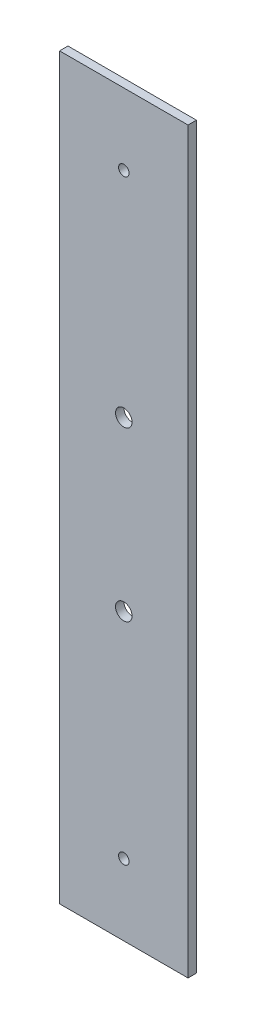
ISO-10303-21;
HEADER;
FILE_DESCRIPTION(('STEP AP214'),'2;1');
FILE_NAME('part.step','',(''),(''),'','','');
FILE_SCHEMA(('AUTOMOTIVE_DESIGN { 1 0 10303 214 1 1 1 1 }'));
ENDSEC;
DATA;
#1=APPLICATION_CONTEXT('core data for automotive mechanical design processes');
#2=APPLICATION_PROTOCOL_DEFINITION('international standard','automotive_design',2000,#1);
#3=PRODUCT_CONTEXT('',#1,'mechanical');
#4=PRODUCT('Part','Part','',(#3));
#5=PRODUCT_RELATED_PRODUCT_CATEGORY('part','',(#4));
#6=PRODUCT_DEFINITION_FORMATION('','',#4);
#7=PRODUCT_DEFINITION_CONTEXT('part definition',#1,'design');
#8=PRODUCT_DEFINITION('design','',#6,#7);
#9=PRODUCT_DEFINITION_SHAPE('','',#8);
#10=(LENGTH_UNIT() NAMED_UNIT(*) SI_UNIT(.MILLI.,.METRE.));
#11=(NAMED_UNIT(*) PLANE_ANGLE_UNIT() SI_UNIT($,.RADIAN.));
#12=(NAMED_UNIT(*) SI_UNIT($,.STERADIAN.) SOLID_ANGLE_UNIT());
#13=UNCERTAINTY_MEASURE_WITH_UNIT(LENGTH_MEASURE(1.E-05),#10,'distance_accuracy_value','');
#14=(GEOMETRIC_REPRESENTATION_CONTEXT(3) GLOBAL_UNCERTAINTY_ASSIGNED_CONTEXT((#13)) GLOBAL_UNIT_ASSIGNED_CONTEXT((#10,
#11,#12)) REPRESENTATION_CONTEXT('',''));
#15=CARTESIAN_POINT('',(0.,0.,0.));
#16=DIRECTION('',(0.,0.,1.));
#17=DIRECTION('',(1.,0.,0.));
#18=AXIS2_PLACEMENT_3D('',#15,#16,#17);
#19=CARTESIAN_POINT('',(-19.431,-114.3,2.54));
#20=DIRECTION('',(1.,0.,0.));
#21=DIRECTION('',(0.,0.,-1.));
#22=AXIS2_PLACEMENT_3D('',#19,#20,#21);
#23=PLANE('',#22);
#24=DIRECTION('',(0.,-1.,0.));
#25=VECTOR('',#24,1.);
#26=CARTESIAN_POINT('',(-19.431,-114.3,2.54));
#27=LINE('',#26,#25);
#28=CARTESIAN_POINT('',(-19.431,111.76,2.54));
#29=VERTEX_POINT('',#28);
#30=CARTESIAN_POINT('',(-19.431,-111.76,2.54));
#31=VERTEX_POINT('',#30);
#32=EDGE_CURVE('E47',#29,#31,#27,.T.);
#33=ORIENTED_EDGE('',*,*,#32,.F.);
#34=DIRECTION('',(0.,0.,1.));
#35=VECTOR('',#34,1.);
#36=CARTESIAN_POINT('',(-19.431,111.76,0.));
#37=LINE('',#36,#35);
#38=CARTESIAN_POINT('',(-19.431,111.76,0.));
#39=VERTEX_POINT('',#38);
#40=EDGE_CURVE('E79',#39,#29,#37,.T.);
#41=ORIENTED_EDGE('',*,*,#40,.F.);
#42=DIRECTION('',(0.,-1.,0.));
#43=VECTOR('',#42,1.);
#44=CARTESIAN_POINT('',(-19.431,-114.3,0.));
#45=LINE('',#44,#43);
#46=CARTESIAN_POINT('',(-19.431,-111.76,0.));
#47=VERTEX_POINT('',#46);
#48=EDGE_CURVE('E103',#39,#47,#45,.T.);
#49=ORIENTED_EDGE('',*,*,#48,.T.);
#50=DIRECTION('',(0.,0.,1.));
#51=VECTOR('',#50,1.);
#52=CARTESIAN_POINT('',(-19.431,-111.76,0.));
#53=LINE('',#52,#51);
#54=EDGE_CURVE('E63',#47,#31,#53,.T.);
#55=ORIENTED_EDGE('',*,*,#54,.T.);
#56=EDGE_LOOP('',(#33,#41,#49,#55));
#57=FACE_BOUND('',#56,.T.);
#58=ADVANCED_FACE('F38',(#57),#23,.F.);
#59=CARTESIAN_POINT('',(19.431,-114.3,2.54));
#60=DIRECTION('',(-1.,0.,0.));
#61=DIRECTION('',(0.,0.,1.));
#62=AXIS2_PLACEMENT_3D('',#59,#60,#61);
#63=PLANE('',#62);
#64=DIRECTION('',(0.,1.,0.));
#65=VECTOR('',#64,1.);
#66=CARTESIAN_POINT('',(19.431,-114.3,0.));
#67=LINE('',#66,#65);
#68=CARTESIAN_POINT('',(19.431,-111.76,0.));
#69=VERTEX_POINT('',#68);
#70=CARTESIAN_POINT('',(19.431,111.76,0.));
#71=VERTEX_POINT('',#70);
#72=EDGE_CURVE('E99',#69,#71,#67,.T.);
#73=ORIENTED_EDGE('',*,*,#72,.T.);
#74=DIRECTION('',(0.,0.,1.));
#75=VECTOR('',#74,1.);
#76=CARTESIAN_POINT('',(19.431,111.76,0.));
#77=LINE('',#76,#75);
#78=CARTESIAN_POINT('',(19.431,111.76,2.54));
#79=VERTEX_POINT('',#78);
#80=EDGE_CURVE('E55',#71,#79,#77,.T.);
#81=ORIENTED_EDGE('',*,*,#80,.T.);
#82=DIRECTION('',(0.,1.,0.));
#83=VECTOR('',#82,1.);
#84=CARTESIAN_POINT('',(19.431,-114.3,2.54));
#85=LINE('',#84,#83);
#86=CARTESIAN_POINT('',(19.431,-111.76,2.54));
#87=VERTEX_POINT('',#86);
#88=EDGE_CURVE('E11',#87,#79,#85,.T.);
#89=ORIENTED_EDGE('',*,*,#88,.F.);
#90=DIRECTION('',(0.,0.,1.));
#91=VECTOR('',#90,1.);
#92=CARTESIAN_POINT('',(19.431,-111.76,0.));
#93=LINE('',#92,#91);
#94=EDGE_CURVE('E130',#69,#87,#93,.T.);
#95=ORIENTED_EDGE('',*,*,#94,.F.);
#96=EDGE_LOOP('',(#73,#81,#89,#95));
#97=FACE_BOUND('',#96,.T.);
#98=ADVANCED_FACE('F151',(#97),#63,.F.);
#99=CARTESIAN_POINT('',(0.,0.,2.54));
#100=DIRECTION('',(0.,0.,1.));
#101=DIRECTION('',(1.,0.,0.));
#102=AXIS2_PLACEMENT_3D('',#99,#100,#101);
#103=PLANE('',#102);
#104=DIRECTION('',(1.,0.,0.));
#105=VECTOR('',#104,1.);
#106=CARTESIAN_POINT('',(-19.431,111.76,2.54));
#107=LINE('',#106,#105);
#108=EDGE_CURVE('E82',#29,#79,#107,.T.);
#109=ORIENTED_EDGE('',*,*,#108,.F.);
#110=ORIENTED_EDGE('',*,*,#32,.T.);
#111=DIRECTION('',(-1.,0.,0.));
#112=VECTOR('',#111,1.);
#113=CARTESIAN_POINT('',(19.431,-111.76,2.54));
#114=LINE('',#113,#112);
#115=EDGE_CURVE('E236',#87,#31,#114,.T.);
#116=ORIENTED_EDGE('',*,*,#115,.F.);
#117=ORIENTED_EDGE('',*,*,#88,.T.);
#118=EDGE_LOOP('',(#109,#110,#116,#117));
#119=FACE_BOUND('',#118,.T.);
#120=CARTESIAN_POINT('',(0.,-25.4,2.54));
#121=DIRECTION('',(0.,0.,1.));
#122=DIRECTION('',(1.,0.,0.));
#123=AXIS2_PLACEMENT_3D('',#120,#121,#122);
#124=CIRCLE('',#123,2.49999999999995);
#125=CARTESIAN_POINT('',(2.49999999999995,-25.4,2.54));
#126=VERTEX_POINT('',#125);
#127=EDGE_CURVE('E114',#126,#126,#124,.T.);
#128=ORIENTED_EDGE('',*,*,#127,.F.);
#129=EDGE_LOOP('',(#128));
#130=FACE_BOUND('',#129,.T.);
#131=CARTESIAN_POINT('',(0.,25.4,2.54));
#132=DIRECTION('',(0.,0.,1.));
#133=DIRECTION('',(1.,0.,0.));
#134=AXIS2_PLACEMENT_3D('',#131,#132,#133);
#135=CIRCLE('',#134,2.49999999999995);
#136=CARTESIAN_POINT('',(2.49999999999995,25.4,2.54));
#137=VERTEX_POINT('',#136);
#138=EDGE_CURVE('E122',#137,#137,#135,.T.);
#139=ORIENTED_EDGE('',*,*,#138,.F.);
#140=EDGE_LOOP('',(#139));
#141=FACE_BOUND('',#140,.T.);
#142=CARTESIAN_POINT('',(0.,90.17,2.54));
#143=DIRECTION('',(0.,0.,-1.));
#144=DIRECTION('',(1.,0.,0.));
#145=AXIS2_PLACEMENT_3D('',#142,#143,#144);
#146=CIRCLE('',#145,1.5875);
#147=CARTESIAN_POINT('',(1.5875,90.17,2.54));
#148=VERTEX_POINT('',#147);
#149=EDGE_CURVE('E120',#148,#148,#146,.T.);
#150=ORIENTED_EDGE('',*,*,#149,.T.);
#151=EDGE_LOOP('',(#150));
#152=FACE_BOUND('',#151,.T.);
#153=CARTESIAN_POINT('',(0.,-90.17,2.54));
#154=DIRECTION('',(0.,0.,1.));
#155=DIRECTION('',(1.,0.,0.));
#156=AXIS2_PLACEMENT_3D('',#153,#154,#155);
#157=CIRCLE('',#156,1.5875);
#158=CARTESIAN_POINT('',(1.5875,-90.17,2.54));
#159=VERTEX_POINT('',#158);
#160=EDGE_CURVE('E106',#159,#159,#157,.T.);
#161=ORIENTED_EDGE('',*,*,#160,.F.);
#162=EDGE_LOOP('',(#161));
#163=FACE_BOUND('',#162,.T.);
#164=ADVANCED_FACE('F92',(#119,#130,#141,#152,#163),#103,.T.);
#165=CARTESIAN_POINT('',(0.,0.,0.));
#166=DIRECTION('',(0.,0.,1.));
#167=DIRECTION('',(1.,0.,0.));
#168=AXIS2_PLACEMENT_3D('',#165,#166,#167);
#169=PLANE('',#168);
#170=CARTESIAN_POINT('',(0.,-25.4,0.));
#171=DIRECTION('',(0.,0.,1.));
#172=DIRECTION('',(1.,0.,0.));
#173=AXIS2_PLACEMENT_3D('',#170,#171,#172);
#174=CIRCLE('',#173,2.49999999999995);
#175=CARTESIAN_POINT('',(2.49999999999995,-25.4,0.));
#176=VERTEX_POINT('',#175);
#177=EDGE_CURVE('E41',#176,#176,#174,.T.);
#178=ORIENTED_EDGE('',*,*,#177,.T.);
#179=EDGE_LOOP('',(#178));
#180=FACE_BOUND('',#179,.T.);
#181=CARTESIAN_POINT('',(0.,25.4,0.));
#182=DIRECTION('',(0.,0.,1.));
#183=DIRECTION('',(1.,0.,0.));
#184=AXIS2_PLACEMENT_3D('',#181,#182,#183);
#185=CIRCLE('',#184,2.49999999999995);
#186=CARTESIAN_POINT('',(2.49999999999995,25.4,0.));
#187=VERTEX_POINT('',#186);
#188=EDGE_CURVE('E111',#187,#187,#185,.T.);
#189=ORIENTED_EDGE('',*,*,#188,.T.);
#190=EDGE_LOOP('',(#189));
#191=FACE_BOUND('',#190,.T.);
#192=CARTESIAN_POINT('',(0.,90.17,0.));
#193=DIRECTION('',(0.,0.,-1.));
#194=DIRECTION('',(1.,0.,0.));
#195=AXIS2_PLACEMENT_3D('',#192,#193,#194);
#196=CIRCLE('',#195,1.5875);
#197=CARTESIAN_POINT('',(1.5875,90.17,0.));
#198=VERTEX_POINT('',#197);
#199=EDGE_CURVE('E133',#198,#198,#196,.T.);
#200=ORIENTED_EDGE('',*,*,#199,.F.);
#201=EDGE_LOOP('',(#200));
#202=FACE_BOUND('',#201,.T.);
#203=CARTESIAN_POINT('',(0.,-90.17,0.));
#204=DIRECTION('',(0.,0.,1.));
#205=DIRECTION('',(1.,0.,0.));
#206=AXIS2_PLACEMENT_3D('',#203,#204,#205);
#207=CIRCLE('',#206,1.5875);
#208=CARTESIAN_POINT('',(1.5875,-90.17,0.));
#209=VERTEX_POINT('',#208);
#210=EDGE_CURVE('E110',#209,#209,#207,.T.);
#211=ORIENTED_EDGE('',*,*,#210,.T.);
#212=EDGE_LOOP('',(#211));
#213=FACE_BOUND('',#212,.T.);
#214=ORIENTED_EDGE('',*,*,#48,.F.);
#215=DIRECTION('',(1.,0.,0.));
#216=VECTOR('',#215,1.);
#217=CARTESIAN_POINT('',(-19.431,111.76,0.));
#218=LINE('',#217,#216);
#219=EDGE_CURVE('E83',#39,#71,#218,.T.);
#220=ORIENTED_EDGE('',*,*,#219,.T.);
#221=ORIENTED_EDGE('',*,*,#72,.F.);
#222=DIRECTION('',(-1.,0.,0.));
#223=VECTOR('',#222,1.);
#224=CARTESIAN_POINT('',(19.431,-111.76,0.));
#225=LINE('',#224,#223);
#226=EDGE_CURVE('E239',#69,#47,#225,.T.);
#227=ORIENTED_EDGE('',*,*,#226,.T.);
#228=EDGE_LOOP('',(#214,#220,#221,#227));
#229=FACE_BOUND('',#228,.T.);
#230=ADVANCED_FACE('F150',(#180,#191,#202,#213,#229),#169,.F.);
#231=CARTESIAN_POINT('',(0.,-90.17,0.));
#232=DIRECTION('',(0.,0.,1.));
#233=DIRECTION('',(1.,0.,0.));
#234=AXIS2_PLACEMENT_3D('',#231,#232,#233);
#235=CYLINDRICAL_SURFACE('',#234,1.5875);
#236=ORIENTED_EDGE('',*,*,#210,.F.);
#237=EDGE_LOOP('',(#236));
#238=FACE_BOUND('',#237,.T.);
#239=ORIENTED_EDGE('',*,*,#160,.T.);
#240=EDGE_LOOP('',(#239));
#241=FACE_BOUND('',#240,.T.);
#242=ADVANCED_FACE('F147',(#238,#241),#235,.F.);
#243=CARTESIAN_POINT('',(0.,90.17,0.));
#244=DIRECTION('',(0.,0.,1.));
#245=DIRECTION('',(1.,0.,0.));
#246=AXIS2_PLACEMENT_3D('',#243,#244,#245);
#247=CYLINDRICAL_SURFACE('',#246,1.5875);
#248=ORIENTED_EDGE('',*,*,#199,.T.);
#249=EDGE_LOOP('',(#248));
#250=FACE_BOUND('',#249,.T.);
#251=ORIENTED_EDGE('',*,*,#149,.F.);
#252=EDGE_LOOP('',(#251));
#253=FACE_BOUND('',#252,.T.);
#254=ADVANCED_FACE('F194',(#250,#253),#247,.F.);
#255=CARTESIAN_POINT('',(0.,25.4,-2.54));
#256=DIRECTION('',(0.,0.,1.));
#257=DIRECTION('',(1.,0.,0.));
#258=AXIS2_PLACEMENT_3D('',#255,#256,#257);
#259=CYLINDRICAL_SURFACE('',#258,2.49999999999995);
#260=ORIENTED_EDGE('',*,*,#138,.T.);
#261=EDGE_LOOP('',(#260));
#262=FACE_BOUND('',#261,.T.);
#263=ORIENTED_EDGE('',*,*,#188,.F.);
#264=EDGE_LOOP('',(#263));
#265=FACE_BOUND('',#264,.T.);
#266=ADVANCED_FACE('F200',(#262,#265),#259,.F.);
#267=CARTESIAN_POINT('',(0.,-25.4,-2.54));
#268=DIRECTION('',(0.,0.,1.));
#269=DIRECTION('',(1.,0.,0.));
#270=AXIS2_PLACEMENT_3D('',#267,#268,#269);
#271=CYLINDRICAL_SURFACE('',#270,2.49999999999995);
#272=ORIENTED_EDGE('',*,*,#127,.T.);
#273=EDGE_LOOP('',(#272));
#274=FACE_BOUND('',#273,.T.);
#275=ORIENTED_EDGE('',*,*,#177,.F.);
#276=EDGE_LOOP('',(#275));
#277=FACE_BOUND('',#276,.T.);
#278=ADVANCED_FACE('F168',(#274,#277),#271,.F.);
#279=CARTESIAN_POINT('',(19.431,-111.76,0.));
#280=DIRECTION('',(0.,1.,0.));
#281=DIRECTION('',(0.,0.,1.));
#282=AXIS2_PLACEMENT_3D('',#279,#280,#281);
#283=PLANE('',#282);
#284=ORIENTED_EDGE('',*,*,#115,.T.);
#285=ORIENTED_EDGE('',*,*,#54,.F.);
#286=ORIENTED_EDGE('',*,*,#226,.F.);
#287=ORIENTED_EDGE('',*,*,#94,.T.);
#288=EDGE_LOOP('',(#284,#285,#286,#287));
#289=FACE_BOUND('',#288,.T.);
#290=ADVANCED_FACE('F212',(#289),#283,.F.);
#291=CARTESIAN_POINT('',(-19.431,111.76,0.));
#292=DIRECTION('',(0.,-1.,0.));
#293=DIRECTION('',(1.,0.,0.));
#294=AXIS2_PLACEMENT_3D('',#291,#292,#293);
#295=PLANE('',#294);
#296=ORIENTED_EDGE('',*,*,#108,.T.);
#297=ORIENTED_EDGE('',*,*,#80,.F.);
#298=ORIENTED_EDGE('',*,*,#219,.F.);
#299=ORIENTED_EDGE('',*,*,#40,.T.);
#300=EDGE_LOOP('',(#296,#297,#298,#299));
#301=FACE_BOUND('',#300,.T.);
#302=ADVANCED_FACE('F81',(#301),#295,.F.);
#303=CLOSED_SHELL('',(#58,#98,#164,#230,#242,#254,#266,#278,#290,#302));
#304=MANIFOLD_SOLID_BREP('B2',#303);
#305=ADVANCED_BREP_SHAPE_REPRESENTATION('',(#18,#304),#14);
#306=SHAPE_DEFINITION_REPRESENTATION(#9,#305);
ENDSEC;
END-ISO-10303-21;
